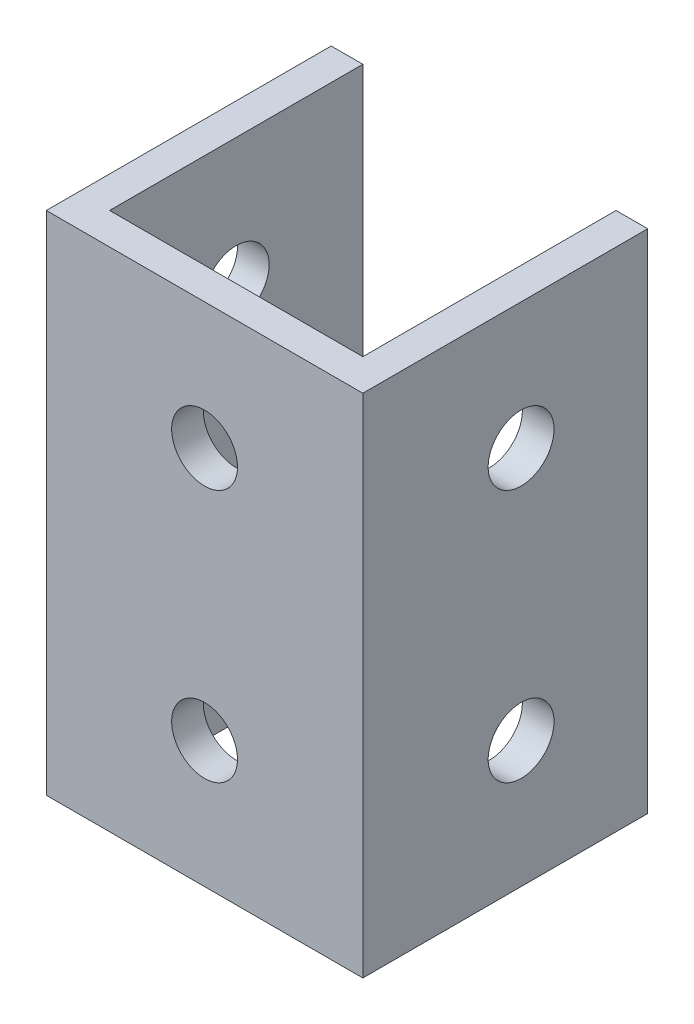
ISO-10303-21;
HEADER;
FILE_DESCRIPTION(('STEP AP214'),'2;1');
FILE_NAME('part.step','',(''),(''),'','','');
FILE_SCHEMA(('AUTOMOTIVE_DESIGN { 1 0 10303 214 1 1 1 1 }'));
ENDSEC;
DATA;
#1=APPLICATION_CONTEXT('core data for automotive mechanical design processes');
#2=APPLICATION_PROTOCOL_DEFINITION('international standard','automotive_design',2000,#1);
#3=PRODUCT_CONTEXT('',#1,'mechanical');
#4=PRODUCT('Part','Part','',(#3));
#5=PRODUCT_RELATED_PRODUCT_CATEGORY('part','',(#4));
#6=PRODUCT_DEFINITION_FORMATION('','',#4);
#7=PRODUCT_DEFINITION_CONTEXT('part definition',#1,'design');
#8=PRODUCT_DEFINITION('design','',#6,#7);
#9=PRODUCT_DEFINITION_SHAPE('','',#8);
#10=(LENGTH_UNIT() NAMED_UNIT(*) SI_UNIT(.MILLI.,.METRE.));
#11=(NAMED_UNIT(*) PLANE_ANGLE_UNIT() SI_UNIT($,.RADIAN.));
#12=(NAMED_UNIT(*) SI_UNIT($,.STERADIAN.) SOLID_ANGLE_UNIT());
#13=UNCERTAINTY_MEASURE_WITH_UNIT(LENGTH_MEASURE(1.E-05),#10,'distance_accuracy_value','');
#14=(GEOMETRIC_REPRESENTATION_CONTEXT(3) GLOBAL_UNCERTAINTY_ASSIGNED_CONTEXT((#13)) GLOBAL_UNIT_ASSIGNED_CONTEXT((#10,
#11,#12)) REPRESENTATION_CONTEXT('',''));
#15=CARTESIAN_POINT('',(0.,0.,0.));
#16=DIRECTION('',(0.,0.,1.));
#17=DIRECTION('',(1.,0.,0.));
#18=AXIS2_PLACEMENT_3D('',#15,#16,#17);
#19=CARTESIAN_POINT('',(3.175,50.8,0.));
#20=DIRECTION('',(0.,0.,1.));
#21=DIRECTION('',(1.,0.,0.));
#22=AXIS2_PLACEMENT_3D('',#19,#20,#21);
#23=PLANE('',#22);
#24=DIRECTION('',(-1.,0.,0.));
#25=VECTOR('',#24,1.);
#26=CARTESIAN_POINT('',(3.175,0.,0.));
#27=LINE('',#26,#25);
#28=CARTESIAN_POINT('',(3.175,0.,0.));
#29=VERTEX_POINT('',#28);
#30=CARTESIAN_POINT('',(0.,0.,0.));
#31=VERTEX_POINT('',#30);
#32=EDGE_CURVE('E130',#29,#31,#27,.T.);
#33=ORIENTED_EDGE('',*,*,#32,.T.);
#34=DIRECTION('',(0.,-1.,0.));
#35=VECTOR('',#34,1.);
#36=CARTESIAN_POINT('',(0.,50.8,0.));
#37=LINE('',#36,#35);
#38=CARTESIAN_POINT('',(0.,50.8,0.));
#39=VERTEX_POINT('',#38);
#40=EDGE_CURVE('E11',#39,#31,#37,.T.);
#41=ORIENTED_EDGE('',*,*,#40,.F.);
#42=DIRECTION('',(-1.,0.,0.));
#43=VECTOR('',#42,1.);
#44=CARTESIAN_POINT('',(3.175,50.8,0.));
#45=LINE('',#44,#43);
#46=CARTESIAN_POINT('',(3.175,50.8,0.));
#47=VERTEX_POINT('',#46);
#48=EDGE_CURVE('E145',#47,#39,#45,.T.);
#49=ORIENTED_EDGE('',*,*,#48,.F.);
#50=DIRECTION('',(0.,-1.,0.));
#51=VECTOR('',#50,1.);
#52=CARTESIAN_POINT('',(3.175,50.8,0.));
#53=LINE('',#52,#51);
#54=EDGE_CURVE('E126',#47,#29,#53,.T.);
#55=ORIENTED_EDGE('',*,*,#54,.T.);
#56=EDGE_LOOP('',(#33,#41,#49,#55));
#57=FACE_BOUND('',#56,.T.);
#58=ADVANCED_FACE('F32',(#57),#23,.F.);
#59=CARTESIAN_POINT('',(0.,50.8,0.));
#60=DIRECTION('',(1.,0.,0.));
#61=DIRECTION('',(0.,0.,-1.));
#62=AXIS2_PLACEMENT_3D('',#59,#60,#61);
#63=PLANE('',#62);
#64=CARTESIAN_POINT('',(0.,12.7,12.7));
#65=DIRECTION('',(1.,0.,0.));
#66=DIRECTION('',(0.,0.,-1.));
#67=AXIS2_PLACEMENT_3D('',#64,#65,#66);
#68=CIRCLE('',#67,3.302);
#69=CARTESIAN_POINT('',(0.,12.7,9.398));
#70=VERTEX_POINT('',#69);
#71=EDGE_CURVE('E318',#70,#70,#68,.T.);
#72=ORIENTED_EDGE('',*,*,#71,.T.);
#73=EDGE_LOOP('',(#72));
#74=FACE_BOUND('',#73,.T.);
#75=CARTESIAN_POINT('',(0.,38.1,12.7));
#76=DIRECTION('',(1.,0.,0.));
#77=DIRECTION('',(0.,0.,-1.));
#78=AXIS2_PLACEMENT_3D('',#75,#76,#77);
#79=CIRCLE('',#78,3.302);
#80=CARTESIAN_POINT('',(0.,38.1,9.398));
#81=VERTEX_POINT('',#80);
#82=EDGE_CURVE('E159',#81,#81,#79,.T.);
#83=ORIENTED_EDGE('',*,*,#82,.T.);
#84=EDGE_LOOP('',(#83));
#85=FACE_BOUND('',#84,.T.);
#86=DIRECTION('',(0.,0.,1.));
#87=VECTOR('',#86,1.);
#88=CARTESIAN_POINT('',(0.,0.,0.));
#89=LINE('',#88,#87);
#90=CARTESIAN_POINT('',(0.,0.,28.575));
#91=VERTEX_POINT('',#90);
#92=EDGE_CURVE('E133',#31,#91,#89,.T.);
#93=ORIENTED_EDGE('',*,*,#92,.T.);
#94=DIRECTION('',(0.,-1.,0.));
#95=VECTOR('',#94,1.);
#96=CARTESIAN_POINT('',(0.,50.8,28.575));
#97=LINE('',#96,#95);
#98=CARTESIAN_POINT('',(0.,50.8,28.575));
#99=VERTEX_POINT('',#98);
#100=EDGE_CURVE('E41',#99,#91,#97,.T.);
#101=ORIENTED_EDGE('',*,*,#100,.F.);
#102=DIRECTION('',(0.,0.,1.));
#103=VECTOR('',#102,1.);
#104=CARTESIAN_POINT('',(0.,50.8,0.));
#105=LINE('',#104,#103);
#106=EDGE_CURVE('E93',#39,#99,#105,.T.);
#107=ORIENTED_EDGE('',*,*,#106,.F.);
#108=ORIENTED_EDGE('',*,*,#40,.T.);
#109=EDGE_LOOP('',(#93,#101,#107,#108));
#110=FACE_BOUND('',#109,.T.);
#111=ADVANCED_FACE('F222',(#74,#85,#110),#63,.F.);
#112=CARTESIAN_POINT('',(0.,50.8,28.575));
#113=DIRECTION('',(0.,0.,-1.));
#114=DIRECTION('',(-1.,0.,0.));
#115=AXIS2_PLACEMENT_3D('',#112,#113,#114);
#116=PLANE('',#115);
#117=CARTESIAN_POINT('',(15.875,12.7,28.575));
#118=DIRECTION('',(0.,0.,1.));
#119=DIRECTION('',(1.,0.,0.));
#120=AXIS2_PLACEMENT_3D('',#117,#118,#119);
#121=CIRCLE('',#120,3.302);
#122=CARTESIAN_POINT('',(19.177,12.7,28.575));
#123=VERTEX_POINT('',#122);
#124=EDGE_CURVE('E163',#123,#123,#121,.T.);
#125=ORIENTED_EDGE('',*,*,#124,.F.);
#126=EDGE_LOOP('',(#125));
#127=FACE_BOUND('',#126,.T.);
#128=CARTESIAN_POINT('',(15.875,38.1,28.575));
#129=DIRECTION('',(0.,0.,1.));
#130=DIRECTION('',(1.,0.,0.));
#131=AXIS2_PLACEMENT_3D('',#128,#129,#130);
#132=CIRCLE('',#131,3.302);
#133=CARTESIAN_POINT('',(19.177,38.1,28.575));
#134=VERTEX_POINT('',#133);
#135=EDGE_CURVE('E181',#134,#134,#132,.T.);
#136=ORIENTED_EDGE('',*,*,#135,.F.);
#137=EDGE_LOOP('',(#136));
#138=FACE_BOUND('',#137,.T.);
#139=DIRECTION('',(1.,0.,0.));
#140=VECTOR('',#139,1.);
#141=CARTESIAN_POINT('',(0.,0.,28.575));
#142=LINE('',#141,#140);
#143=CARTESIAN_POINT('',(31.75,0.,28.575));
#144=VERTEX_POINT('',#143);
#145=EDGE_CURVE('E136',#91,#144,#142,.T.);
#146=ORIENTED_EDGE('',*,*,#145,.T.);
#147=DIRECTION('',(0.,-1.,0.));
#148=VECTOR('',#147,1.);
#149=CARTESIAN_POINT('',(31.75,50.8,28.575));
#150=LINE('',#149,#148);
#151=CARTESIAN_POINT('',(31.75,50.8,28.575));
#152=VERTEX_POINT('',#151);
#153=EDGE_CURVE('E152',#152,#144,#150,.T.);
#154=ORIENTED_EDGE('',*,*,#153,.F.);
#155=DIRECTION('',(1.,0.,0.));
#156=VECTOR('',#155,1.);
#157=CARTESIAN_POINT('',(0.,50.8,28.575));
#158=LINE('',#157,#156);
#159=EDGE_CURVE('E188',#99,#152,#158,.T.);
#160=ORIENTED_EDGE('',*,*,#159,.F.);
#161=ORIENTED_EDGE('',*,*,#100,.T.);
#162=EDGE_LOOP('',(#146,#154,#160,#161));
#163=FACE_BOUND('',#162,.T.);
#164=ADVANCED_FACE('F226',(#127,#138,#163),#116,.F.);
#165=CARTESIAN_POINT('',(31.75,50.8,28.575));
#166=DIRECTION('',(-1.,0.,0.));
#167=DIRECTION('',(0.,0.,1.));
#168=AXIS2_PLACEMENT_3D('',#165,#166,#167);
#169=PLANE('',#168);
#170=CARTESIAN_POINT('',(31.75,12.7,12.7));
#171=DIRECTION('',(1.,0.,0.));
#172=DIRECTION('',(0.,0.,-1.));
#173=AXIS2_PLACEMENT_3D('',#170,#171,#172);
#174=CIRCLE('',#173,3.302);
#175=CARTESIAN_POINT('',(31.75,12.7,9.398));
#176=VERTEX_POINT('',#175);
#177=EDGE_CURVE('E317',#176,#176,#174,.T.);
#178=ORIENTED_EDGE('',*,*,#177,.F.);
#179=EDGE_LOOP('',(#178));
#180=FACE_BOUND('',#179,.T.);
#181=CARTESIAN_POINT('',(31.75,38.1,12.7));
#182=DIRECTION('',(1.,0.,0.));
#183=DIRECTION('',(0.,0.,-1.));
#184=AXIS2_PLACEMENT_3D('',#181,#182,#183);
#185=CIRCLE('',#184,3.302);
#186=CARTESIAN_POINT('',(31.75,38.1,9.398));
#187=VERTEX_POINT('',#186);
#188=EDGE_CURVE('E166',#187,#187,#185,.T.);
#189=ORIENTED_EDGE('',*,*,#188,.F.);
#190=EDGE_LOOP('',(#189));
#191=FACE_BOUND('',#190,.T.);
#192=DIRECTION('',(0.,0.,-1.));
#193=VECTOR('',#192,1.);
#194=CARTESIAN_POINT('',(31.75,0.,28.575));
#195=LINE('',#194,#193);
#196=CARTESIAN_POINT('',(31.75,0.,0.));
#197=VERTEX_POINT('',#196);
#198=EDGE_CURVE('E138',#144,#197,#195,.T.);
#199=ORIENTED_EDGE('',*,*,#198,.T.);
#200=DIRECTION('',(0.,-1.,0.));
#201=VECTOR('',#200,1.);
#202=CARTESIAN_POINT('',(31.75,50.8,0.));
#203=LINE('',#202,#201);
#204=CARTESIAN_POINT('',(31.75,50.8,0.));
#205=VERTEX_POINT('',#204);
#206=EDGE_CURVE('E149',#205,#197,#203,.T.);
#207=ORIENTED_EDGE('',*,*,#206,.F.);
#208=DIRECTION('',(0.,0.,-1.));
#209=VECTOR('',#208,1.);
#210=CARTESIAN_POINT('',(31.75,50.8,28.575));
#211=LINE('',#210,#209);
#212=EDGE_CURVE('E190',#152,#205,#211,.T.);
#213=ORIENTED_EDGE('',*,*,#212,.F.);
#214=ORIENTED_EDGE('',*,*,#153,.T.);
#215=EDGE_LOOP('',(#199,#207,#213,#214));
#216=FACE_BOUND('',#215,.T.);
#217=ADVANCED_FACE('F196',(#180,#191,#216),#169,.F.);
#218=CARTESIAN_POINT('',(31.75,50.8,0.));
#219=DIRECTION('',(0.,0.,1.));
#220=DIRECTION('',(1.,0.,0.));
#221=AXIS2_PLACEMENT_3D('',#218,#219,#220);
#222=PLANE('',#221);
#223=DIRECTION('',(-1.,0.,0.));
#224=VECTOR('',#223,1.);
#225=CARTESIAN_POINT('',(31.75,0.,0.));
#226=LINE('',#225,#224);
#227=CARTESIAN_POINT('',(28.575,0.,0.));
#228=VERTEX_POINT('',#227);
#229=EDGE_CURVE('E140',#197,#228,#226,.T.);
#230=ORIENTED_EDGE('',*,*,#229,.T.);
#231=DIRECTION('',(0.,-1.,0.));
#232=VECTOR('',#231,1.);
#233=CARTESIAN_POINT('',(28.575,50.8,0.));
#234=LINE('',#233,#232);
#235=CARTESIAN_POINT('',(28.575,50.8,0.));
#236=VERTEX_POINT('',#235);
#237=EDGE_CURVE('E121',#236,#228,#234,.T.);
#238=ORIENTED_EDGE('',*,*,#237,.F.);
#239=DIRECTION('',(-1.,0.,0.));
#240=VECTOR('',#239,1.);
#241=CARTESIAN_POINT('',(31.75,50.8,0.));
#242=LINE('',#241,#240);
#243=EDGE_CURVE('E112',#205,#236,#242,.T.);
#244=ORIENTED_EDGE('',*,*,#243,.F.);
#245=ORIENTED_EDGE('',*,*,#206,.T.);
#246=EDGE_LOOP('',(#230,#238,#244,#245));
#247=FACE_BOUND('',#246,.T.);
#248=ADVANCED_FACE('F200',(#247),#222,.F.);
#249=CARTESIAN_POINT('',(28.575,50.8,0.));
#250=DIRECTION('',(1.,0.,0.));
#251=DIRECTION('',(0.,0.,-1.));
#252=AXIS2_PLACEMENT_3D('',#249,#250,#251);
#253=PLANE('',#252);
#254=CARTESIAN_POINT('',(28.575,12.7,12.7));
#255=DIRECTION('',(1.,0.,0.));
#256=DIRECTION('',(0.,0.,-1.));
#257=AXIS2_PLACEMENT_3D('',#254,#255,#256);
#258=CIRCLE('',#257,3.302);
#259=CARTESIAN_POINT('',(28.575,12.7,9.398));
#260=VERTEX_POINT('',#259);
#261=EDGE_CURVE('E171',#260,#260,#258,.T.);
#262=ORIENTED_EDGE('',*,*,#261,.T.);
#263=EDGE_LOOP('',(#262));
#264=FACE_BOUND('',#263,.T.);
#265=CARTESIAN_POINT('',(28.575,38.1,12.7));
#266=DIRECTION('',(1.,0.,0.));
#267=DIRECTION('',(0.,0.,-1.));
#268=AXIS2_PLACEMENT_3D('',#265,#266,#267);
#269=CIRCLE('',#268,3.302);
#270=CARTESIAN_POINT('',(28.575,38.1,9.398));
#271=VERTEX_POINT('',#270);
#272=EDGE_CURVE('E158',#271,#271,#269,.T.);
#273=ORIENTED_EDGE('',*,*,#272,.T.);
#274=EDGE_LOOP('',(#273));
#275=FACE_BOUND('',#274,.T.);
#276=DIRECTION('',(0.,0.,1.));
#277=VECTOR('',#276,1.);
#278=CARTESIAN_POINT('',(28.575,0.,0.));
#279=LINE('',#278,#277);
#280=CARTESIAN_POINT('',(28.575,0.,25.4));
#281=VERTEX_POINT('',#280);
#282=EDGE_CURVE('E120',#228,#281,#279,.T.);
#283=ORIENTED_EDGE('',*,*,#282,.T.);
#284=DIRECTION('',(0.,-1.,0.));
#285=VECTOR('',#284,1.);
#286=CARTESIAN_POINT('',(28.575,50.8,25.4));
#287=LINE('',#286,#285);
#288=CARTESIAN_POINT('',(28.575,50.8,25.4));
#289=VERTEX_POINT('',#288);
#290=EDGE_CURVE('E117',#289,#281,#287,.T.);
#291=ORIENTED_EDGE('',*,*,#290,.F.);
#292=DIRECTION('',(0.,0.,1.));
#293=VECTOR('',#292,1.);
#294=CARTESIAN_POINT('',(28.575,50.8,0.));
#295=LINE('',#294,#293);
#296=EDGE_CURVE('E106',#236,#289,#295,.T.);
#297=ORIENTED_EDGE('',*,*,#296,.F.);
#298=ORIENTED_EDGE('',*,*,#237,.T.);
#299=EDGE_LOOP('',(#283,#291,#297,#298));
#300=FACE_BOUND('',#299,.T.);
#301=ADVANCED_FACE('F118',(#264,#275,#300),#253,.F.);
#302=CARTESIAN_POINT('',(28.575,50.8,25.4));
#303=DIRECTION('',(0.,0.,1.));
#304=DIRECTION('',(1.,0.,0.));
#305=AXIS2_PLACEMENT_3D('',#302,#303,#304);
#306=PLANE('',#305);
#307=CARTESIAN_POINT('',(15.875,12.7,25.4));
#308=DIRECTION('',(0.,0.,1.));
#309=DIRECTION('',(1.,0.,0.));
#310=AXIS2_PLACEMENT_3D('',#307,#308,#309);
#311=CIRCLE('',#310,3.302);
#312=CARTESIAN_POINT('',(19.177,12.7,25.4));
#313=VERTEX_POINT('',#312);
#314=EDGE_CURVE('E178',#313,#313,#311,.F.);
#315=ORIENTED_EDGE('',*,*,#314,.F.);
#316=EDGE_LOOP('',(#315));
#317=FACE_BOUND('',#316,.T.);
#318=CARTESIAN_POINT('',(15.875,38.1,25.4));
#319=DIRECTION('',(0.,0.,1.));
#320=DIRECTION('',(1.,0.,0.));
#321=AXIS2_PLACEMENT_3D('',#318,#319,#320);
#322=CIRCLE('',#321,3.302);
#323=CARTESIAN_POINT('',(19.177,38.1,25.4));
#324=VERTEX_POINT('',#323);
#325=EDGE_CURVE('E134',#324,#324,#322,.F.);
#326=ORIENTED_EDGE('',*,*,#325,.F.);
#327=EDGE_LOOP('',(#326));
#328=FACE_BOUND('',#327,.T.);
#329=DIRECTION('',(-1.,0.,0.));
#330=VECTOR('',#329,1.);
#331=CARTESIAN_POINT('',(28.575,0.,25.4));
#332=LINE('',#331,#330);
#333=CARTESIAN_POINT('',(3.175,0.,25.4));
#334=VERTEX_POINT('',#333);
#335=EDGE_CURVE('E79',#281,#334,#332,.T.);
#336=ORIENTED_EDGE('',*,*,#335,.T.);
#337=DIRECTION('',(0.,-1.,0.));
#338=VECTOR('',#337,1.);
#339=CARTESIAN_POINT('',(3.175,50.8,25.4));
#340=LINE('',#339,#338);
#341=CARTESIAN_POINT('',(3.175,50.8,25.4));
#342=VERTEX_POINT('',#341);
#343=EDGE_CURVE('E122',#342,#334,#340,.T.);
#344=ORIENTED_EDGE('',*,*,#343,.F.);
#345=DIRECTION('',(-1.,0.,0.));
#346=VECTOR('',#345,1.);
#347=CARTESIAN_POINT('',(28.575,50.8,25.4));
#348=LINE('',#347,#346);
#349=EDGE_CURVE('E110',#289,#342,#348,.T.);
#350=ORIENTED_EDGE('',*,*,#349,.F.);
#351=ORIENTED_EDGE('',*,*,#290,.T.);
#352=EDGE_LOOP('',(#336,#344,#350,#351));
#353=FACE_BOUND('',#352,.T.);
#354=ADVANCED_FACE('F124',(#317,#328,#353),#306,.F.);
#355=CARTESIAN_POINT('',(3.175,50.8,25.4));
#356=DIRECTION('',(-1.,0.,0.));
#357=DIRECTION('',(0.,0.,1.));
#358=AXIS2_PLACEMENT_3D('',#355,#356,#357);
#359=PLANE('',#358);
#360=CARTESIAN_POINT('',(3.175,12.7,12.7));
#361=DIRECTION('',(-1.,0.,0.));
#362=DIRECTION('',(0.,0.,1.));
#363=AXIS2_PLACEMENT_3D('',#360,#361,#362);
#364=CIRCLE('',#363,3.302);
#365=CARTESIAN_POINT('',(3.175,12.7,16.002));
#366=VERTEX_POINT('',#365);
#367=EDGE_CURVE('E35',#366,#366,#364,.T.);
#368=ORIENTED_EDGE('',*,*,#367,.T.);
#369=EDGE_LOOP('',(#368));
#370=FACE_BOUND('',#369,.T.);
#371=CARTESIAN_POINT('',(3.175,38.1,12.7));
#372=DIRECTION('',(-1.,0.,0.));
#373=DIRECTION('',(0.,0.,1.));
#374=AXIS2_PLACEMENT_3D('',#371,#372,#373);
#375=CIRCLE('',#374,3.302);
#376=CARTESIAN_POINT('',(3.175,38.1,16.002));
#377=VERTEX_POINT('',#376);
#378=EDGE_CURVE('E156',#377,#377,#375,.T.);
#379=ORIENTED_EDGE('',*,*,#378,.T.);
#380=EDGE_LOOP('',(#379));
#381=FACE_BOUND('',#380,.T.);
#382=DIRECTION('',(0.,0.,-1.));
#383=VECTOR('',#382,1.);
#384=CARTESIAN_POINT('',(3.175,0.,25.4));
#385=LINE('',#384,#383);
#386=EDGE_CURVE('E85',#334,#29,#385,.T.);
#387=ORIENTED_EDGE('',*,*,#386,.T.);
#388=ORIENTED_EDGE('',*,*,#54,.F.);
#389=DIRECTION('',(0.,0.,-1.));
#390=VECTOR('',#389,1.);
#391=CARTESIAN_POINT('',(3.175,50.8,25.4));
#392=LINE('',#391,#390);
#393=EDGE_CURVE('E50',#342,#47,#392,.T.);
#394=ORIENTED_EDGE('',*,*,#393,.F.);
#395=ORIENTED_EDGE('',*,*,#343,.T.);
#396=EDGE_LOOP('',(#387,#388,#394,#395));
#397=FACE_BOUND('',#396,.T.);
#398=ADVANCED_FACE('F208',(#370,#381,#397),#359,.F.);
#399=CARTESIAN_POINT('',(0.,50.8,0.));
#400=DIRECTION('',(0.,1.,0.));
#401=DIRECTION('',(0.,0.,1.));
#402=AXIS2_PLACEMENT_3D('',#399,#400,#401);
#403=PLANE('',#402);
#404=ORIENTED_EDGE('',*,*,#48,.T.);
#405=ORIENTED_EDGE('',*,*,#106,.T.);
#406=ORIENTED_EDGE('',*,*,#159,.T.);
#407=ORIENTED_EDGE('',*,*,#212,.T.);
#408=ORIENTED_EDGE('',*,*,#243,.T.);
#409=ORIENTED_EDGE('',*,*,#296,.T.);
#410=ORIENTED_EDGE('',*,*,#349,.T.);
#411=ORIENTED_EDGE('',*,*,#393,.T.);
#412=EDGE_LOOP('',(#404,#405,#406,#407,#408,#409,#410,#411));
#413=FACE_BOUND('',#412,.T.);
#414=ADVANCED_FACE('F108',(#413),#403,.T.);
#415=CARTESIAN_POINT('',(0.,0.,0.));
#416=DIRECTION('',(0.,1.,0.));
#417=DIRECTION('',(0.,0.,1.));
#418=AXIS2_PLACEMENT_3D('',#415,#416,#417);
#419=PLANE('',#418);
#420=ORIENTED_EDGE('',*,*,#32,.F.);
#421=ORIENTED_EDGE('',*,*,#386,.F.);
#422=ORIENTED_EDGE('',*,*,#335,.F.);
#423=ORIENTED_EDGE('',*,*,#282,.F.);
#424=ORIENTED_EDGE('',*,*,#229,.F.);
#425=ORIENTED_EDGE('',*,*,#198,.F.);
#426=ORIENTED_EDGE('',*,*,#145,.F.);
#427=ORIENTED_EDGE('',*,*,#92,.F.);
#428=EDGE_LOOP('',(#420,#421,#422,#423,#424,#425,#426,#427));
#429=FACE_BOUND('',#428,.T.);
#430=ADVANCED_FACE('F203',(#429),#419,.F.);
#431=CARTESIAN_POINT('',(15.875,38.1,-0.001000000000001));
#432=DIRECTION('',(0.,0.,1.));
#433=DIRECTION('',(1.,0.,0.));
#434=AXIS2_PLACEMENT_3D('',#431,#432,#433);
#435=CYLINDRICAL_SURFACE('',#434,3.302);
#436=ORIENTED_EDGE('',*,*,#135,.T.);
#437=EDGE_LOOP('',(#436));
#438=FACE_BOUND('',#437,.T.);
#439=ORIENTED_EDGE('',*,*,#325,.T.);
#440=EDGE_LOOP('',(#439));
#441=FACE_BOUND('',#440,.T.);
#442=ADVANCED_FACE('F267',(#438,#441),#435,.F.);
#443=CARTESIAN_POINT('',(15.875,12.7,-0.001000000000001));
#444=DIRECTION('',(0.,0.,1.));
#445=DIRECTION('',(1.,0.,0.));
#446=AXIS2_PLACEMENT_3D('',#443,#444,#445);
#447=CYLINDRICAL_SURFACE('',#446,3.302);
#448=ORIENTED_EDGE('',*,*,#124,.T.);
#449=EDGE_LOOP('',(#448));
#450=FACE_BOUND('',#449,.T.);
#451=ORIENTED_EDGE('',*,*,#314,.T.);
#452=EDGE_LOOP('',(#451));
#453=FACE_BOUND('',#452,.T.);
#454=ADVANCED_FACE('F262',(#450,#453),#447,.F.);
#455=CARTESIAN_POINT('',(0.,38.1,12.7));
#456=DIRECTION('',(1.,0.,0.));
#457=DIRECTION('',(0.,0.,-1.));
#458=AXIS2_PLACEMENT_3D('',#455,#456,#457);
#459=CYLINDRICAL_SURFACE('',#458,3.302);
#460=ORIENTED_EDGE('',*,*,#82,.F.);
#461=EDGE_LOOP('',(#460));
#462=FACE_BOUND('',#461,.T.);
#463=ORIENTED_EDGE('',*,*,#378,.F.);
#464=EDGE_LOOP('',(#463));
#465=FACE_BOUND('',#464,.T.);
#466=ADVANCED_FACE('F252',(#462,#465),#459,.F.);
#467=ORIENTED_EDGE('',*,*,#188,.T.);
#468=EDGE_LOOP('',(#467));
#469=FACE_BOUND('',#468,.T.);
#470=ORIENTED_EDGE('',*,*,#272,.F.);
#471=EDGE_LOOP('',(#470));
#472=FACE_BOUND('',#471,.T.);
#473=ADVANCED_FACE('F249',(#469,#472),#459,.F.);
#474=CARTESIAN_POINT('',(0.,12.7,12.7));
#475=DIRECTION('',(1.,0.,0.));
#476=DIRECTION('',(0.,0.,-1.));
#477=AXIS2_PLACEMENT_3D('',#474,#475,#476);
#478=CYLINDRICAL_SURFACE('',#477,3.302);
#479=ORIENTED_EDGE('',*,*,#71,.F.);
#480=EDGE_LOOP('',(#479));
#481=FACE_BOUND('',#480,.T.);
#482=ORIENTED_EDGE('',*,*,#367,.F.);
#483=EDGE_LOOP('',(#482));
#484=FACE_BOUND('',#483,.T.);
#485=ADVANCED_FACE('F251',(#481,#484),#478,.F.);
#486=ORIENTED_EDGE('',*,*,#177,.T.);
#487=EDGE_LOOP('',(#486));
#488=FACE_BOUND('',#487,.T.);
#489=ORIENTED_EDGE('',*,*,#261,.F.);
#490=EDGE_LOOP('',(#489));
#491=FACE_BOUND('',#490,.T.);
#492=ADVANCED_FACE('F259',(#488,#491),#478,.F.);
#493=CLOSED_SHELL('',(#58,#111,#164,#217,#248,#301,#354,#398,#414,#430,#442,#454,#466,#473,#485,#492));
#494=MANIFOLD_SOLID_BREP('B2',#493);
#495=ADVANCED_BREP_SHAPE_REPRESENTATION('',(#18,#494),#14);
#496=SHAPE_DEFINITION_REPRESENTATION(#9,#495);
ENDSEC;
END-ISO-10303-21;
